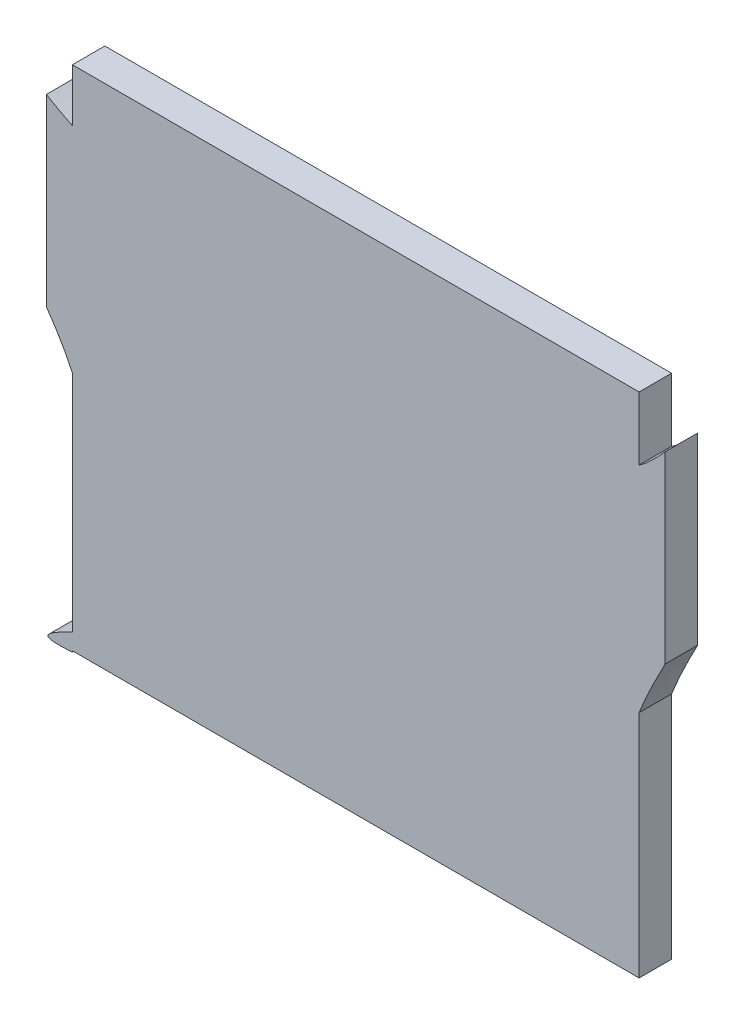
ISO-10303-21;
HEADER;
FILE_DESCRIPTION(('STEP AP214'),'2;1');
FILE_NAME('part.step','',(''),(''),'','','');
FILE_SCHEMA(('AUTOMOTIVE_DESIGN { 1 0 10303 214 1 1 1 1 }'));
ENDSEC;
DATA;
#1=APPLICATION_CONTEXT('core data for automotive mechanical design processes');
#2=APPLICATION_PROTOCOL_DEFINITION('international standard','automotive_design',2000,#1);
#3=PRODUCT_CONTEXT('',#1,'mechanical');
#4=PRODUCT('Part','Part','',(#3));
#5=PRODUCT_RELATED_PRODUCT_CATEGORY('part','',(#4));
#6=PRODUCT_DEFINITION_FORMATION('','',#4);
#7=PRODUCT_DEFINITION_CONTEXT('part definition',#1,'design');
#8=PRODUCT_DEFINITION('design','',#6,#7);
#9=PRODUCT_DEFINITION_SHAPE('','',#8);
#10=(LENGTH_UNIT() NAMED_UNIT(*) SI_UNIT(.MILLI.,.METRE.));
#11=(NAMED_UNIT(*) PLANE_ANGLE_UNIT() SI_UNIT($,.RADIAN.));
#12=(NAMED_UNIT(*) SI_UNIT($,.STERADIAN.) SOLID_ANGLE_UNIT());
#13=UNCERTAINTY_MEASURE_WITH_UNIT(LENGTH_MEASURE(1.E-05),#10,'distance_accuracy_value','');
#14=(GEOMETRIC_REPRESENTATION_CONTEXT(3) GLOBAL_UNCERTAINTY_ASSIGNED_CONTEXT((#13)) GLOBAL_UNIT_ASSIGNED_CONTEXT((#10,
#11,#12)) REPRESENTATION_CONTEXT('',''));
#15=CARTESIAN_POINT('',(0.,0.,0.));
#16=DIRECTION('',(0.,0.,1.));
#17=DIRECTION('',(1.,0.,0.));
#18=AXIS2_PLACEMENT_3D('',#15,#16,#17);
#19=CARTESIAN_POINT('',(-69.7223123683583,-123.736,51.9999999999997));
#20=DIRECTION('',(-0.973511689159507,0.228637247774295,0.));
#21=DIRECTION('',(-0.228637247774295,-0.973511689159507,0.));
#22=AXIS2_PLACEMENT_3D('',#19,#20,#21);
#23=PLANE('',#22);
#24=DIRECTION('',(0.228637247774295,0.973511689159507,0.));
#25=VECTOR('',#24,1.);
#26=CARTESIAN_POINT('',(-69.7223123683583,-123.736,43.9999999999997));
#27=LINE('',#26,#25);
#28=CARTESIAN_POINT('',(-69.7932068177427,-124.0378605929,43.9999999999997));
#29=VERTEX_POINT('',#28);
#30=CARTESIAN_POINT('',(-69.7223123683583,-123.736,43.9999999999997));
#31=VERTEX_POINT('',#30);
#32=EDGE_CURVE('E220',#29,#31,#27,.T.);
#33=ORIENTED_EDGE('',*,*,#32,.T.);
#34=DIRECTION('',(0.,0.,-1.));
#35=VECTOR('',#34,1.);
#36=CARTESIAN_POINT('',(-69.7223123683583,-123.736,51.9999999999997));
#37=LINE('',#36,#35);
#38=CARTESIAN_POINT('',(-69.7223123683583,-123.736,51.9999999999997));
#39=VERTEX_POINT('',#38);
#40=EDGE_CURVE('E11',#39,#31,#37,.T.);
#41=ORIENTED_EDGE('',*,*,#40,.F.);
#42=DIRECTION('',(0.228637247774295,0.973511689159507,0.));
#43=VECTOR('',#42,1.);
#44=CARTESIAN_POINT('',(-69.7223123683583,-123.736,51.9999999999997));
#45=LINE('',#44,#43);
#46=CARTESIAN_POINT('',(-69.7932068177427,-124.0378605929,51.9999999999997));
#47=VERTEX_POINT('',#46);
#48=EDGE_CURVE('E181',#47,#39,#45,.T.);
#49=ORIENTED_EDGE('',*,*,#48,.F.);
#50=DIRECTION('',(0.,0.,-1.));
#51=VECTOR('',#50,1.);
#52=CARTESIAN_POINT('',(-69.7932068177427,-124.0378605929,51.9999999999997));
#53=LINE('',#52,#51);
#54=EDGE_CURVE('E166',#47,#29,#53,.T.);
#55=ORIENTED_EDGE('',*,*,#54,.T.);
#56=EDGE_LOOP('',(#33,#41,#49,#55));
#57=FACE_BOUND('',#56,.T.);
#58=ADVANCED_FACE('F30',(#57),#23,.F.);
#59=CARTESIAN_POINT('',(-69.7223123683583,-123.736,51.9999999999997));
#60=DIRECTION('',(0.,1.,0.));
#61=DIRECTION('',(-1.,0.,0.));
#62=AXIS2_PLACEMENT_3D('',#59,#60,#61);
#63=PLANE('',#62);
#64=DIRECTION('',(1.,0.,0.));
#65=VECTOR('',#64,1.);
#66=CARTESIAN_POINT('',(-69.7223123683583,-123.736,43.9999999999997));
#67=LINE('',#66,#65);
#68=CARTESIAN_POINT('',(69.7871756056273,-123.736,43.9999999999997));
#69=VERTEX_POINT('',#68);
#70=EDGE_CURVE('E214',#31,#69,#67,.T.);
#71=ORIENTED_EDGE('',*,*,#70,.T.);
#72=DIRECTION('',(0.,0.,-1.));
#73=VECTOR('',#72,1.);
#74=CARTESIAN_POINT('',(69.7871756056273,-123.736,51.9999999999997));
#75=LINE('',#74,#73);
#76=CARTESIAN_POINT('',(69.7871756056273,-123.736,51.9999999999997));
#77=VERTEX_POINT('',#76);
#78=EDGE_CURVE('E39',#77,#69,#75,.T.);
#79=ORIENTED_EDGE('',*,*,#78,.F.);
#80=DIRECTION('',(1.,0.,0.));
#81=VECTOR('',#80,1.);
#82=CARTESIAN_POINT('',(-69.7223123683583,-123.736,51.9999999999997));
#83=LINE('',#82,#81);
#84=EDGE_CURVE('E111',#39,#77,#83,.T.);
#85=ORIENTED_EDGE('',*,*,#84,.F.);
#86=ORIENTED_EDGE('',*,*,#40,.T.);
#87=EDGE_LOOP('',(#71,#79,#85,#86));
#88=FACE_BOUND('',#87,.T.);
#89=ADVANCED_FACE('F403',(#88),#63,.F.);
#90=CARTESIAN_POINT('',(69.7870545014945,-67.1329233019573,51.9999999999997));
#91=DIRECTION('',(-0.999999999997711,-2.13953268890916E-06,0.));
#92=DIRECTION('',(2.13953268890916E-06,-0.999999999997711,0.));
#93=AXIS2_PLACEMENT_3D('',#90,#91,#92);
#94=PLANE('',#93);
#95=DIRECTION('',(-2.13953268890916E-06,0.999999999997711,0.));
#96=VECTOR('',#95,1.);
#97=CARTESIAN_POINT('',(69.7870545014945,-67.1329233019573,43.9999999999997));
#98=LINE('',#97,#96);
#99=CARTESIAN_POINT('',(69.7870545014945,-67.1329233019573,43.9999999999997));
#100=VERTEX_POINT('',#99);
#101=EDGE_CURVE('E219',#69,#100,#98,.T.);
#102=ORIENTED_EDGE('',*,*,#101,.T.);
#103=DIRECTION('',(0.,0.,-1.));
#104=VECTOR('',#103,1.);
#105=CARTESIAN_POINT('',(69.7870545014945,-67.1329233019573,51.9999999999997));
#106=LINE('',#105,#104);
#107=CARTESIAN_POINT('',(69.7870545014945,-67.1329233019573,51.9999999999997));
#108=VERTEX_POINT('',#107);
#109=EDGE_CURVE('E234',#108,#100,#106,.T.);
#110=ORIENTED_EDGE('',*,*,#109,.F.);
#111=DIRECTION('',(-2.13953268890916E-06,0.999999999997711,0.));
#112=VECTOR('',#111,1.);
#113=CARTESIAN_POINT('',(69.7870545014945,-67.1329233019573,51.9999999999997));
#114=LINE('',#113,#112);
#115=EDGE_CURVE('E431',#77,#108,#114,.T.);
#116=ORIENTED_EDGE('',*,*,#115,.F.);
#117=ORIENTED_EDGE('',*,*,#78,.T.);
#118=EDGE_LOOP('',(#102,#110,#116,#117));
#119=FACE_BOUND('',#118,.T.);
#120=ADVANCED_FACE('F408',(#119),#94,.F.);
#121=CARTESIAN_POINT('',(69.7870545014945,-67.1329233019573,51.9999999999997));
#122=CARTESIAN_POINT('',(69.8987351477501,-66.8508845632766,51.9999999999997));
#123=CARTESIAN_POINT('',(70.1233875917448,-66.2835464069344,51.9999999999997));
#124=CARTESIAN_POINT('',(70.474179310848,-65.4325837451714,51.9999999999997));
#125=CARTESIAN_POINT('',(70.8369325037786,-64.5757193694243,51.9999999999997));
#126=CARTESIAN_POINT('',(71.2120298176207,-63.713702372659,51.9999999999997));
#127=CARTESIAN_POINT('',(71.5986738004664,-62.8468379595476,51.9999999999997));
#128=CARTESIAN_POINT('',(71.996383934673,-61.9755732179745,51.9999999999997));
#129=CARTESIAN_POINT('',(72.4045638303992,-61.1003269345542,51.9999999999997));
#130=CARTESIAN_POINT('',(72.8226204128379,-60.2215440051033,51.9999999999997));
#131=CARTESIAN_POINT('',(73.2499007470807,-59.3396688384362,51.9999999999997));
#132=CARTESIAN_POINT('',(73.6856852534667,-58.4551377543125,51.9999999999997));
#133=CARTESIAN_POINT('',(74.1292519903981,-57.5684069838605,51.9999999999997));
#134=CARTESIAN_POINT('',(74.5798220159515,-56.6799235201794,51.9999999999997));
#135=CARTESIAN_POINT('',(75.0367465385745,-55.7902230289632,51.9999999999997));
#136=CARTESIAN_POINT('',(75.5790396430957,-54.7453804926052,51.9999999999997));
#137=CARTESIAN_POINT('',(75.9726214225833,-53.999094187479,51.9999999999997));
#138=CARTESIAN_POINT('',(76.2101404755321,-53.5487247200384,51.9999999999997));
#139=B_SPLINE_CURVE_WITH_KNOTS('',3,(#121,#122,#123,#124,#125,#126,#127,#128,#129,#130,#131,
#132,#133,#134,#135,#136,#137,#138),.UNSPECIFIED.,.F.,.F.,(4,1,1,1,1,1,1,1,1,1,1,1,1,1,1,4),(0.,
0.0605306303006695,0.121761061468543,0.183662458002644,0.246203083783382,0.309349045374621,
0.373065313413783,0.437314665948885,0.502057631104992,0.567252397263625,0.632854876290372,
0.69881919988516,0.76509788291915,0.831641464196542,0.898398853646323,1.),.UNSPECIFIED.);
#140=DIRECTION('',(0.,0.,-1.));
#141=VECTOR('',#140,1.);
#142=SURFACE_OF_LINEAR_EXTRUSION('',#139,#141);
#143=CARTESIAN_POINT('',(69.7870545014945,-67.1329233019573,43.9999999999997));
#144=CARTESIAN_POINT('',(69.8987351477501,-66.8508845632766,43.9999999999997));
#145=CARTESIAN_POINT('',(70.1233875917448,-66.2835464069344,43.9999999999997));
#146=CARTESIAN_POINT('',(70.474179310848,-65.4325837451714,43.9999999999997));
#147=CARTESIAN_POINT('',(70.8369325037786,-64.5757193694243,43.9999999999997));
#148=CARTESIAN_POINT('',(71.2120298176207,-63.713702372659,43.9999999999997));
#149=CARTESIAN_POINT('',(71.5986738004664,-62.8468379595476,43.9999999999997));
#150=CARTESIAN_POINT('',(71.996383934673,-61.9755732179745,43.9999999999997));
#151=CARTESIAN_POINT('',(72.4045638303992,-61.1003269345542,43.9999999999997));
#152=CARTESIAN_POINT('',(72.8226204128379,-60.2215440051033,43.9999999999997));
#153=CARTESIAN_POINT('',(73.2499007470807,-59.3396688384362,43.9999999999997));
#154=CARTESIAN_POINT('',(73.6856852534667,-58.4551377543125,43.9999999999997));
#155=CARTESIAN_POINT('',(74.1292519903981,-57.5684069838605,43.9999999999997));
#156=CARTESIAN_POINT('',(74.5798220159515,-56.6799235201794,43.9999999999997));
#157=CARTESIAN_POINT('',(75.0367465385745,-55.7902230289632,43.9999999999997));
#158=CARTESIAN_POINT('',(75.5790396430957,-54.7453804926052,43.9999999999997));
#159=CARTESIAN_POINT('',(75.9726214225833,-53.999094187479,43.9999999999997));
#160=CARTESIAN_POINT('',(76.2101404755321,-53.5487247200384,43.9999999999997));
#161=B_SPLINE_CURVE_WITH_KNOTS('',3,(#143,#144,#145,#146,#147,#148,#149,#150,#151,#152,#153,
#154,#155,#156,#157,#158,#159,#160),.UNSPECIFIED.,.F.,.F.,(4,1,1,1,1,1,1,1,1,1,1,1,1,1,1,4),(0.,
0.0605306303006695,0.121761061468543,0.183662458002644,0.246203083783382,0.309349045374621,
0.373065313413783,0.437314665948885,0.502057631104992,0.567252397263625,0.632854876290372,
0.69881919988516,0.76509788291915,0.831641464196542,0.898398853646323,1.),.UNSPECIFIED.);
#162=CARTESIAN_POINT('',(76.2101404755321,-53.5487247200384,43.9999999999997));
#163=VERTEX_POINT('',#162);
#164=EDGE_CURVE('E454',#100,#163,#161,.T.);
#165=ORIENTED_EDGE('',*,*,#164,.T.);
#166=DIRECTION('',(0.,0.,-1.));
#167=VECTOR('',#166,1.);
#168=CARTESIAN_POINT('',(76.2101404755321,-53.5487247200384,51.9999999999997));
#169=LINE('',#168,#167);
#170=CARTESIAN_POINT('',(76.2101404755321,-53.5487247200384,51.9999999999997));
#171=VERTEX_POINT('',#170);
#172=EDGE_CURVE('E443',#171,#163,#169,.T.);
#173=ORIENTED_EDGE('',*,*,#172,.F.);
#174=CARTESIAN_POINT('',(76.2101404755321,-53.5487247200384,51.9999999999997));
#175=CARTESIAN_POINT('',(75.9726214225833,-53.999094187479,51.9999999999997));
#176=CARTESIAN_POINT('',(75.5790396430957,-54.7453804926052,51.9999999999997));
#177=CARTESIAN_POINT('',(75.0367465385745,-55.7902230289632,51.9999999999997));
#178=CARTESIAN_POINT('',(74.5798220159515,-56.6799235201794,51.9999999999997));
#179=CARTESIAN_POINT('',(74.1292519903981,-57.5684069838605,51.9999999999997));
#180=CARTESIAN_POINT('',(73.6856852534667,-58.4551377543125,51.9999999999997));
#181=CARTESIAN_POINT('',(73.2499007470807,-59.3396688384362,51.9999999999997));
#182=CARTESIAN_POINT('',(72.8226204128379,-60.2215440051033,51.9999999999997));
#183=CARTESIAN_POINT('',(72.4045638303992,-61.1003269345542,51.9999999999997));
#184=CARTESIAN_POINT('',(71.996383934673,-61.9755732179745,51.9999999999997));
#185=CARTESIAN_POINT('',(71.5986738004664,-62.8468379595476,51.9999999999997));
#186=CARTESIAN_POINT('',(71.2120298176207,-63.713702372659,51.9999999999997));
#187=CARTESIAN_POINT('',(70.8369325037786,-64.5757193694243,51.9999999999997));
#188=CARTESIAN_POINT('',(70.474179310848,-65.4325837451714,51.9999999999997));
#189=CARTESIAN_POINT('',(70.1233875917448,-66.2835464069344,51.9999999999997));
#190=CARTESIAN_POINT('',(69.8987351477501,-66.8508845632766,51.9999999999997));
#191=CARTESIAN_POINT('',(69.7870545014945,-67.1329233019573,51.9999999999997));
#192=B_SPLINE_CURVE_WITH_KNOTS('',3,(#174,#175,#176,#177,#178,#179,#180,#181,#182,#183,#184,
#185,#186,#187,#188,#189,#190,#191),.UNSPECIFIED.,.F.,.F.,(4,1,1,1,1,1,1,1,1,1,1,1,1,1,1,4),(0.,
0.101601146353677,0.168358535803458,0.23490211708085,0.30118080011484,0.367145123709628,
0.432747602736375,0.497942368895008,0.562685334051115,0.626934686586217,0.690650954625379,
0.753796916216618,0.816337541997356,0.878238938531457,0.93946936969933,1.),.UNSPECIFIED.);
#193=EDGE_CURVE('E433',#108,#171,#192,.F.);
#194=ORIENTED_EDGE('',*,*,#193,.F.);
#195=ORIENTED_EDGE('',*,*,#109,.T.);
#196=EDGE_LOOP('',(#165,#173,#194,#195));
#197=FACE_BOUND('',#196,.T.);
#198=ADVANCED_FACE('F459',(#197),#142,.F.);
#199=CARTESIAN_POINT('',(76.210259011342,-8.27745407916536,51.9999999999997));
#200=DIRECTION('',(-0.999999999996572,2.6183451067489E-06,0.));
#201=DIRECTION('',(-2.6183451067489E-06,-0.999999999996572,0.));
#202=AXIS2_PLACEMENT_3D('',#199,#200,#201);
#203=PLANE('',#202);
#204=DIRECTION('',(2.6183451067489E-06,0.999999999996572,0.));
#205=VECTOR('',#204,1.);
#206=CARTESIAN_POINT('',(76.210259011342,-8.27745407916536,43.9999999999997));
#207=LINE('',#206,#205);
#208=CARTESIAN_POINT('',(76.210259011342,-8.27745407916536,43.9999999999997));
#209=VERTEX_POINT('',#208);
#210=EDGE_CURVE('E588',#163,#209,#207,.T.);
#211=ORIENTED_EDGE('',*,*,#210,.T.);
#212=DIRECTION('',(0.,0.,-1.));
#213=VECTOR('',#212,1.);
#214=CARTESIAN_POINT('',(76.210259011342,-8.27745407916536,51.9999999999997));
#215=LINE('',#214,#213);
#216=CARTESIAN_POINT('',(76.210259011342,-8.27745407916536,51.9999999999997));
#217=VERTEX_POINT('',#216);
#218=EDGE_CURVE('E448',#217,#209,#215,.T.);
#219=ORIENTED_EDGE('',*,*,#218,.F.);
#220=DIRECTION('',(2.6183451067489E-06,0.999999999996572,0.));
#221=VECTOR('',#220,1.);
#222=CARTESIAN_POINT('',(76.210259011342,-8.27745407916536,51.9999999999997));
#223=LINE('',#222,#221);
#224=EDGE_CURVE('E278',#171,#217,#223,.T.);
#225=ORIENTED_EDGE('',*,*,#224,.F.);
#226=ORIENTED_EDGE('',*,*,#172,.T.);
#227=EDGE_LOOP('',(#211,#219,#225,#226));
#228=FACE_BOUND('',#227,.T.);
#229=ADVANCED_FACE('F292',(#228),#203,.F.);
#230=CARTESIAN_POINT('',(76.210259011342,-8.27745407916536,51.9999999999997));
#231=CARTESIAN_POINT('',(76.1707094278855,-8.32424548017544,51.9999999999997));
#232=CARTESIAN_POINT('',(75.7613767193911,-8.80852999687017,51.9999999999997));
#233=CARTESIAN_POINT('',(75.1401150225099,-9.49014430645207,51.9999999999997));
#234=CARTESIAN_POINT('',(74.3431551639856,-10.3140996062215,51.9999999999997));
#235=CARTESIAN_POINT('',(73.5384854746003,-11.1315376096416,51.9999999999997));
#236=CARTESIAN_POINT('',(72.4937923496919,-12.1663865474611,51.9999999999997));
#237=CARTESIAN_POINT('',(71.2121696523156,-13.3132020448576,51.9999999999997));
#238=CARTESIAN_POINT('',(70.2774630022475,-14.0241571564419,51.9999999999997));
#239=CARTESIAN_POINT('',(69.8094644388859,-14.3340722231048,51.9999999999997));
#240=CARTESIAN_POINT('',(69.7871280168438,-14.3488637080966,51.9999999999997));
#241=B_SPLINE_CURVE_WITH_KNOTS('',3,(#230,#231,#232,#233,#234,#235,#236,#237,#238,#239,#240),
.UNSPECIFIED.,.F.,.F.,(4,1,1,1,1,1,1,1,4),(0.,0.0207459187732433,0.214717384596452,
0.312095933804728,0.408918069322787,0.603125471273589,0.809930821364082,0.990928464906596,1.),.UNSPECIFIED.);
#242=DIRECTION('',(0.,0.,-1.));
#243=VECTOR('',#242,1.);
#244=SURFACE_OF_LINEAR_EXTRUSION('',#241,#243);
#245=CARTESIAN_POINT('',(76.210259011342,-8.27745407916536,43.9999999999997));
#246=CARTESIAN_POINT('',(76.1707094278855,-8.32424548017544,43.9999999999997));
#247=CARTESIAN_POINT('',(75.7613767193911,-8.80852999687017,43.9999999999997));
#248=CARTESIAN_POINT('',(75.1401150225099,-9.49014430645207,43.9999999999997));
#249=CARTESIAN_POINT('',(74.3431551639856,-10.3140996062215,43.9999999999997));
#250=CARTESIAN_POINT('',(73.5384854746003,-11.1315376096416,43.9999999999997));
#251=CARTESIAN_POINT('',(72.4937923496919,-12.1663865474611,43.9999999999997));
#252=CARTESIAN_POINT('',(71.2121696523156,-13.3132020448576,43.9999999999997));
#253=CARTESIAN_POINT('',(70.2774630022475,-14.0241571564419,43.9999999999997));
#254=CARTESIAN_POINT('',(69.8094644388859,-14.3340722231048,43.9999999999997));
#255=CARTESIAN_POINT('',(69.7871280168438,-14.3488637080966,43.9999999999997));
#256=B_SPLINE_CURVE_WITH_KNOTS('',3,(#245,#246,#247,#248,#249,#250,#251,#252,#253,#254,#255),
.UNSPECIFIED.,.F.,.F.,(4,1,1,1,1,1,1,1,4),(0.,0.0207459187732433,0.214717384596452,
0.312095933804728,0.408918069322787,0.603125471273589,0.809930821364082,0.990928464906596,1.),.UNSPECIFIED.);
#257=CARTESIAN_POINT('',(69.7871280168438,-14.3488637080966,43.9999999999997));
#258=VERTEX_POINT('',#257);
#259=EDGE_CURVE('E584',#209,#258,#256,.T.);
#260=ORIENTED_EDGE('',*,*,#259,.T.);
#261=DIRECTION('',(0.,0.,-1.));
#262=VECTOR('',#261,1.);
#263=CARTESIAN_POINT('',(69.7871280168438,-14.3488637080966,51.9999999999997));
#264=LINE('',#263,#262);
#265=CARTESIAN_POINT('',(69.7871280168438,-14.3488637080966,51.9999999999997));
#266=VERTEX_POINT('',#265);
#267=EDGE_CURVE('E232',#266,#258,#264,.T.);
#268=ORIENTED_EDGE('',*,*,#267,.F.);
#269=CARTESIAN_POINT('',(69.7871280168438,-14.3488637080966,51.9999999999997));
#270=CARTESIAN_POINT('',(69.8094644388859,-14.3340722231048,51.9999999999997));
#271=CARTESIAN_POINT('',(70.2774630022475,-14.0241571564419,51.9999999999997));
#272=CARTESIAN_POINT('',(71.2121696523156,-13.3132020448576,51.9999999999997));
#273=CARTESIAN_POINT('',(72.4937923496919,-12.1663865474611,51.9999999999997));
#274=CARTESIAN_POINT('',(73.5384854746003,-11.1315376096416,51.9999999999997));
#275=CARTESIAN_POINT('',(74.3431551639856,-10.3140996062215,51.9999999999997));
#276=CARTESIAN_POINT('',(75.1401150225099,-9.49014430645207,51.9999999999997));
#277=CARTESIAN_POINT('',(75.7613767193911,-8.80852999687017,51.9999999999997));
#278=CARTESIAN_POINT('',(76.1707094278855,-8.32424548017544,51.9999999999997));
#279=CARTESIAN_POINT('',(76.210259011342,-8.27745407916536,51.9999999999997));
#280=B_SPLINE_CURVE_WITH_KNOTS('',3,(#269,#270,#271,#272,#273,#274,#275,#276,#277,#278,#279),
.UNSPECIFIED.,.F.,.F.,(4,1,1,1,1,1,1,1,4),(0.,0.0090715350934043,0.190069178635918,
0.396874528726411,0.591081930677213,0.687904066195272,0.785282615403548,0.979254081226757,1.),.UNSPECIFIED.);
#281=EDGE_CURVE('E273',#217,#266,#280,.F.);
#282=ORIENTED_EDGE('',*,*,#281,.F.);
#283=ORIENTED_EDGE('',*,*,#218,.T.);
#284=EDGE_LOOP('',(#260,#268,#282,#283));
#285=FACE_BOUND('',#284,.T.);
#286=ADVANCED_FACE('F280',(#285),#244,.F.);
#287=CARTESIAN_POINT('',(69.7871799845661,1.25599999999985,51.9999999999997));
#288=DIRECTION('',(-0.999999999994455,3.3302259653013E-06,0.));
#289=DIRECTION('',(-3.3302259653013E-06,-0.999999999994455,0.));
#290=AXIS2_PLACEMENT_3D('',#287,#288,#289);
#291=PLANE('',#290);
#292=DIRECTION('',(3.3302259653013E-06,0.999999999994455,0.));
#293=VECTOR('',#292,1.);
#294=CARTESIAN_POINT('',(69.7871799845661,1.25599999999985,43.9999999999997));
#295=LINE('',#294,#293);
#296=CARTESIAN_POINT('',(69.7871799845661,1.25599999999985,43.9999999999997));
#297=VERTEX_POINT('',#296);
#298=EDGE_CURVE('E224',#258,#297,#295,.T.);
#299=ORIENTED_EDGE('',*,*,#298,.T.);
#300=DIRECTION('',(0.,0.,-1.));
#301=VECTOR('',#300,1.);
#302=CARTESIAN_POINT('',(69.7871799845661,1.25599999999985,51.9999999999997));
#303=LINE('',#302,#301);
#304=CARTESIAN_POINT('',(69.7871799845661,1.25599999999985,51.9999999999997));
#305=VERTEX_POINT('',#304);
#306=EDGE_CURVE('E228',#305,#297,#303,.T.);
#307=ORIENTED_EDGE('',*,*,#306,.F.);
#308=DIRECTION('',(3.3302259653013E-06,0.999999999994455,0.));
#309=VECTOR('',#308,1.);
#310=CARTESIAN_POINT('',(69.7871799845661,1.25599999999985,51.9999999999997));
#311=LINE('',#310,#309);
#312=EDGE_CURVE('E310',#266,#305,#311,.T.);
#313=ORIENTED_EDGE('',*,*,#312,.F.);
#314=ORIENTED_EDGE('',*,*,#267,.T.);
#315=EDGE_LOOP('',(#299,#307,#313,#314));
#316=FACE_BOUND('',#315,.T.);
#317=ADVANCED_FACE('F291',(#316),#291,.F.);
#318=CARTESIAN_POINT('',(69.7871799845661,1.25599999999985,51.9999999999997));
#319=DIRECTION('',(0.,-1.,0.));
#320=DIRECTION('',(1.,0.,0.));
#321=AXIS2_PLACEMENT_3D('',#318,#319,#320);
#322=PLANE('',#321);
#323=DIRECTION('',(-1.,0.,0.));
#324=VECTOR('',#323,1.);
#325=CARTESIAN_POINT('',(69.7871799845661,1.25599999999985,43.9999999999997));
#326=LINE('',#325,#324);
#327=CARTESIAN_POINT('',(-69.7871669522999,1.25599999999988,43.9999999999997));
#328=VERTEX_POINT('',#327);
#329=EDGE_CURVE('E221',#297,#328,#326,.T.);
#330=ORIENTED_EDGE('',*,*,#329,.T.);
#331=DIRECTION('',(0.,0.,-1.));
#332=VECTOR('',#331,1.);
#333=CARTESIAN_POINT('',(-69.7871669522999,1.25599999999988,51.9999999999997));
#334=LINE('',#333,#332);
#335=CARTESIAN_POINT('',(-69.7871669522999,1.25599999999988,51.9999999999997));
#336=VERTEX_POINT('',#335);
#337=EDGE_CURVE('E225',#336,#328,#334,.T.);
#338=ORIENTED_EDGE('',*,*,#337,.F.);
#339=DIRECTION('',(-1.,0.,0.));
#340=VECTOR('',#339,1.);
#341=CARTESIAN_POINT('',(69.7871799845661,1.25599999999985,51.9999999999997));
#342=LINE('',#341,#340);
#343=EDGE_CURVE('E305',#305,#336,#342,.T.);
#344=ORIENTED_EDGE('',*,*,#343,.F.);
#345=ORIENTED_EDGE('',*,*,#306,.T.);
#346=EDGE_LOOP('',(#330,#338,#344,#345));
#347=FACE_BOUND('',#346,.T.);
#348=ADVANCED_FACE('F498',(#347),#322,.F.);
#349=CARTESIAN_POINT('',(-69.7871669522999,1.25599999999988,51.9999999999997));
#350=DIRECTION('',(0.999999999800094,1.99953065799111E-05,0.));
#351=DIRECTION('',(-1.99953065799111E-05,0.999999999800094,0.));
#352=AXIS2_PLACEMENT_3D('',#349,#350,#351);
#353=PLANE('',#352);
#354=DIRECTION('',(1.99953065799111E-05,-0.999999999800094,0.));
#355=VECTOR('',#354,1.);
#356=CARTESIAN_POINT('',(-69.7871669522999,1.25599999999988,43.9999999999997));
#357=LINE('',#356,#355);
#358=CARTESIAN_POINT('',(-69.786907975781,-11.6958653667162,43.9999999999997));
#359=VERTEX_POINT('',#358);
#360=EDGE_CURVE('E223',#328,#359,#357,.T.);
#361=ORIENTED_EDGE('',*,*,#360,.T.);
#362=DIRECTION('',(0.,0.,-1.));
#363=VECTOR('',#362,1.);
#364=CARTESIAN_POINT('',(-69.786907975781,-11.6958653667162,51.9999999999997));
#365=LINE('',#364,#363);
#366=CARTESIAN_POINT('',(-69.786907975781,-11.6958653667162,51.9999999999997));
#367=VERTEX_POINT('',#366);
#368=EDGE_CURVE('E229',#367,#359,#365,.T.);
#369=ORIENTED_EDGE('',*,*,#368,.F.);
#370=DIRECTION('',(1.99953065799111E-05,-0.999999999800094,0.));
#371=VECTOR('',#370,1.);
#372=CARTESIAN_POINT('',(-69.7871669522999,1.25599999999988,51.9999999999997));
#373=LINE('',#372,#371);
#374=EDGE_CURVE('E309',#336,#367,#373,.T.);
#375=ORIENTED_EDGE('',*,*,#374,.F.);
#376=ORIENTED_EDGE('',*,*,#337,.T.);
#377=EDGE_LOOP('',(#361,#369,#375,#376));
#378=FACE_BOUND('',#377,.T.);
#379=ADVANCED_FACE('F324',(#378),#353,.F.);
#380=CARTESIAN_POINT('',(-69.786907975781,-11.6958653667162,51.9999999999997));
#381=CARTESIAN_POINT('',(-69.8955306085048,-11.6487576756369,51.9999999999997));
#382=CARTESIAN_POINT('',(-70.1144782253131,-11.5538040141712,51.9999999999997));
#383=CARTESIAN_POINT('',(-70.4417889055179,-11.4032040928395,51.9999999999997));
#384=CARTESIAN_POINT('',(-70.7709405875501,-11.2468418895113,51.9999999999997));
#385=CARTESIAN_POINT('',(-71.1006417737461,-11.0854688611094,51.9999999999997));
#386=CARTESIAN_POINT('',(-71.853512668118,-10.7084419157255,51.9999999999997));
#387=CARTESIAN_POINT('',(-73.0050561545857,-10.1056125662571,51.9999999999997));
#388=CARTESIAN_POINT('',(-74.2988494506271,-9.40609870469594,51.9999999999997));
#389=CARTESIAN_POINT('',(-75.3114135751951,-8.82299419917881,51.9999999999997));
#390=CARTESIAN_POINT('',(-75.8639097615492,-8.49133377814753,51.9999999999997));
#391=CARTESIAN_POINT('',(-76.1621359516664,-8.30717491150047,51.9999999999997));
#392=CARTESIAN_POINT('',(-76.2099585527271,-8.27764378276897,51.9999999999997));
#393=B_SPLINE_CURVE_WITH_KNOTS('',3,(#380,#381,#382,#383,#384,#385,#386,#387,#388,#389,#390,
#391,#392),.UNSPECIFIED.,.F.,.F.,(4,1,1,1,1,1,1,1,1,1,4),(0.,0.0487851803798605,
0.0983349299487392,0.148451785398495,0.198937848338315,0.24958727041676,0.495399035570065,
0.734490034724737,0.855572554666401,0.976840075321043,1.),.UNSPECIFIED.);
#394=DIRECTION('',(0.,0.,-1.));
#395=VECTOR('',#394,1.);
#396=SURFACE_OF_LINEAR_EXTRUSION('',#393,#395);
#397=CARTESIAN_POINT('',(-69.786907975781,-11.6958653667162,43.9999999999997));
#398=CARTESIAN_POINT('',(-69.8955306085048,-11.6487576756369,43.9999999999997));
#399=CARTESIAN_POINT('',(-70.1144782253131,-11.5538040141712,43.9999999999997));
#400=CARTESIAN_POINT('',(-70.4417889055179,-11.4032040928395,43.9999999999997));
#401=CARTESIAN_POINT('',(-70.7709405875501,-11.2468418895113,43.9999999999997));
#402=CARTESIAN_POINT('',(-71.1006417737461,-11.0854688611094,43.9999999999997));
#403=CARTESIAN_POINT('',(-71.853512668118,-10.7084419157255,43.9999999999997));
#404=CARTESIAN_POINT('',(-73.0050561545857,-10.1056125662571,43.9999999999997));
#405=CARTESIAN_POINT('',(-74.2988494506271,-9.40609870469594,43.9999999999997));
#406=CARTESIAN_POINT('',(-75.3114135751951,-8.82299419917881,43.9999999999997));
#407=CARTESIAN_POINT('',(-75.8639097615492,-8.49133377814753,43.9999999999997));
#408=CARTESIAN_POINT('',(-76.1621359516664,-8.30717491150047,43.9999999999997));
#409=CARTESIAN_POINT('',(-76.2099585527271,-8.27764378276897,43.9999999999997));
#410=B_SPLINE_CURVE_WITH_KNOTS('',3,(#397,#398,#399,#400,#401,#402,#403,#404,#405,#406,#407,
#408,#409),.UNSPECIFIED.,.F.,.F.,(4,1,1,1,1,1,1,1,1,1,4),(0.,0.0487851803798605,
0.0983349299487392,0.148451785398495,0.198937848338315,0.24958727041676,0.495399035570065,
0.734490034724737,0.855572554666401,0.976840075321043,1.),.UNSPECIFIED.);
#411=CARTESIAN_POINT('',(-76.2099585527271,-8.27764378276897,43.9999999999997));
#412=VERTEX_POINT('',#411);
#413=EDGE_CURVE('E347',#359,#412,#410,.T.);
#414=ORIENTED_EDGE('',*,*,#413,.T.);
#415=DIRECTION('',(0.,0.,-1.));
#416=VECTOR('',#415,1.);
#417=CARTESIAN_POINT('',(-76.2099585527271,-8.27764378276897,51.9999999999997));
#418=LINE('',#417,#416);
#419=CARTESIAN_POINT('',(-76.2099585527271,-8.27764378276897,51.9999999999997));
#420=VERTEX_POINT('',#419);
#421=EDGE_CURVE('E374',#420,#412,#418,.T.);
#422=ORIENTED_EDGE('',*,*,#421,.F.);
#423=CARTESIAN_POINT('',(-76.2099585527271,-8.27764378276897,51.9999999999997));
#424=CARTESIAN_POINT('',(-76.1621359516664,-8.30717491150047,51.9999999999997));
#425=CARTESIAN_POINT('',(-75.8639097615492,-8.49133377814753,51.9999999999997));
#426=CARTESIAN_POINT('',(-75.3114135751951,-8.82299419917881,51.9999999999997));
#427=CARTESIAN_POINT('',(-74.2988494506271,-9.40609870469594,51.9999999999997));
#428=CARTESIAN_POINT('',(-73.0050561545857,-10.1056125662571,51.9999999999997));
#429=CARTESIAN_POINT('',(-71.853512668118,-10.7084419157255,51.9999999999997));
#430=CARTESIAN_POINT('',(-71.1006417737461,-11.0854688611094,51.9999999999997));
#431=CARTESIAN_POINT('',(-70.7709405875501,-11.2468418895113,51.9999999999997));
#432=CARTESIAN_POINT('',(-70.4417889055179,-11.4032040928395,51.9999999999997));
#433=CARTESIAN_POINT('',(-70.1144782253131,-11.5538040141712,51.9999999999997));
#434=CARTESIAN_POINT('',(-69.8955306085048,-11.6487576756369,51.9999999999997));
#435=CARTESIAN_POINT('',(-69.786907975781,-11.6958653667162,51.9999999999997));
#436=B_SPLINE_CURVE_WITH_KNOTS('',3,(#423,#424,#425,#426,#427,#428,#429,#430,#431,#432,#433,
#434,#435),.UNSPECIFIED.,.F.,.F.,(4,1,1,1,1,1,1,1,1,1,4),(0.,0.0231599246789566,
0.144427445333599,0.265509965275263,0.504600964429935,0.75041272958324,0.801062151661685,
0.851548214601505,0.901665070051261,0.95121481962014,1.),.UNSPECIFIED.);
#437=EDGE_CURVE('E372',#367,#420,#436,.F.);
#438=ORIENTED_EDGE('',*,*,#437,.F.);
#439=ORIENTED_EDGE('',*,*,#368,.T.);
#440=EDGE_LOOP('',(#414,#422,#438,#439));
#441=FACE_BOUND('',#440,.T.);
#442=ADVANCED_FACE('F318',(#441),#396,.F.);
#443=CARTESIAN_POINT('',(-76.2099585527271,-8.27764378276897,51.9999999999997));
#444=DIRECTION('',(0.999999999982887,5.85027287169161E-06,0.));
#445=DIRECTION('',(-5.85027287169161E-06,0.999999999982887,0.));
#446=AXIS2_PLACEMENT_3D('',#443,#444,#445);
#447=PLANE('',#446);
#448=DIRECTION('',(5.85027287169161E-06,-0.999999999982887,0.));
#449=VECTOR('',#448,1.);
#450=CARTESIAN_POINT('',(-76.2099585527271,-8.27764378276897,43.9999999999997));
#451=LINE('',#450,#449);
#452=CARTESIAN_POINT('',(-76.2096936993741,-53.5496095166001,43.9999999999997));
#453=VERTEX_POINT('',#452);
#454=EDGE_CURVE('E360',#412,#453,#451,.T.);
#455=ORIENTED_EDGE('',*,*,#454,.T.);
#456=DIRECTION('',(0.,0.,-1.));
#457=VECTOR('',#456,1.);
#458=CARTESIAN_POINT('',(-76.2096936993741,-53.5496095166001,51.9999999999997));
#459=LINE('',#458,#457);
#460=CARTESIAN_POINT('',(-76.2096936993741,-53.5496095166001,51.9999999999997));
#461=VERTEX_POINT('',#460);
#462=EDGE_CURVE('E161',#461,#453,#459,.T.);
#463=ORIENTED_EDGE('',*,*,#462,.F.);
#464=DIRECTION('',(5.85027287169161E-06,-0.999999999982887,0.));
#465=VECTOR('',#464,1.);
#466=CARTESIAN_POINT('',(-76.2099585527271,-8.27764378276897,51.9999999999997));
#467=LINE('',#466,#465);
#468=EDGE_CURVE('E149',#420,#461,#467,.T.);
#469=ORIENTED_EDGE('',*,*,#468,.F.);
#470=ORIENTED_EDGE('',*,*,#421,.T.);
#471=EDGE_LOOP('',(#455,#463,#469,#470));
#472=FACE_BOUND('',#471,.T.);
#473=ADVANCED_FACE('F323',(#472),#447,.F.);
#474=CARTESIAN_POINT('',(-76.2096936993741,-53.5496095166001,51.9999999999997));
#475=CARTESIAN_POINT('',(-76.027839765227,-53.8081313922568,51.9999999999997));
#476=CARTESIAN_POINT('',(-75.6701640249004,-54.3165999260821,51.9999999999997));
#477=CARTESIAN_POINT('',(-75.152878356121,-55.0737278994551,51.9999999999997));
#478=CARTESIAN_POINT('',(-74.6604380389072,-55.8103065124199,51.9999999999997));
#479=CARTESIAN_POINT('',(-73.7130897624795,-57.2619510763065,51.9999999999997));
#480=CARTESIAN_POINT('',(-72.4106219489402,-59.3836238541776,51.9999999999997));
#481=CARTESIAN_POINT('',(-71.1500792785475,-61.6833761405067,51.9999999999997));
#482=CARTESIAN_POINT('',(-70.308346776541,-63.359550981891,51.9999999999997));
#483=CARTESIAN_POINT('',(-69.9591799002739,-64.1071425622997,51.9999999999997));
#484=CARTESIAN_POINT('',(-69.7869525793412,-64.4758937348683,51.9999999999997));
#485=B_SPLINE_CURVE_WITH_KNOTS('',3,(#474,#475,#476,#477,#478,#479,#480,#481,#482,#483,#484),
.UNSPECIFIED.,.F.,.F.,(4,1,1,1,1,1,1,1,4),(0.,0.074712697240977,0.146947160768348,
0.216744284083706,0.284145753445015,0.556686570884535,0.804970533547428,0.903801291608315,1.),.UNSPECIFIED.);
#486=DIRECTION('',(0.,0.,-1.));
#487=VECTOR('',#486,1.);
#488=SURFACE_OF_LINEAR_EXTRUSION('',#485,#487);
#489=CARTESIAN_POINT('',(-76.2096936993741,-53.5496095166001,43.9999999999997));
#490=CARTESIAN_POINT('',(-76.027839765227,-53.8081313922568,43.9999999999997));
#491=CARTESIAN_POINT('',(-75.6701640249004,-54.3165999260821,43.9999999999997));
#492=CARTESIAN_POINT('',(-75.152878356121,-55.0737278994551,43.9999999999997));
#493=CARTESIAN_POINT('',(-74.6604380389072,-55.8103065124199,43.9999999999997));
#494=CARTESIAN_POINT('',(-73.7130897624795,-57.2619510763065,43.9999999999997));
#495=CARTESIAN_POINT('',(-72.4106219489402,-59.3836238541776,43.9999999999997));
#496=CARTESIAN_POINT('',(-71.1500792785475,-61.6833761405067,43.9999999999997));
#497=CARTESIAN_POINT('',(-70.308346776541,-63.359550981891,43.9999999999997));
#498=CARTESIAN_POINT('',(-69.9591799002739,-64.1071425622997,43.9999999999997));
#499=CARTESIAN_POINT('',(-69.7869525793412,-64.4758937348683,43.9999999999997));
#500=B_SPLINE_CURVE_WITH_KNOTS('',3,(#489,#490,#491,#492,#493,#494,#495,#496,#497,#498,#499),
.UNSPECIFIED.,.F.,.F.,(4,1,1,1,1,1,1,1,4),(0.,0.074712697240977,0.146947160768348,
0.216744284083706,0.284145753445015,0.556686570884535,0.804970533547428,0.903801291608315,1.),.UNSPECIFIED.);
#501=CARTESIAN_POINT('',(-69.7869525793412,-64.4758937348683,43.9999999999997));
#502=VERTEX_POINT('',#501);
#503=EDGE_CURVE('E159',#453,#502,#500,.T.);
#504=ORIENTED_EDGE('',*,*,#503,.T.);
#505=DIRECTION('',(0.,0.,-1.));
#506=VECTOR('',#505,1.);
#507=CARTESIAN_POINT('',(-69.7869525793412,-64.4758937348683,51.9999999999997));
#508=LINE('',#507,#506);
#509=CARTESIAN_POINT('',(-69.7869525793412,-64.4758937348683,51.9999999999997));
#510=VERTEX_POINT('',#509);
#511=EDGE_CURVE('E156',#510,#502,#508,.T.);
#512=ORIENTED_EDGE('',*,*,#511,.F.);
#513=CARTESIAN_POINT('',(-69.7869525793412,-64.4758937348683,51.9999999999997));
#514=CARTESIAN_POINT('',(-69.9591799002739,-64.1071425622997,51.9999999999997));
#515=CARTESIAN_POINT('',(-70.308346776541,-63.359550981891,51.9999999999997));
#516=CARTESIAN_POINT('',(-71.1500792785475,-61.6833761405067,51.9999999999997));
#517=CARTESIAN_POINT('',(-72.4106219489402,-59.3836238541776,51.9999999999997));
#518=CARTESIAN_POINT('',(-73.7130897624795,-57.2619510763065,51.9999999999997));
#519=CARTESIAN_POINT('',(-74.6604380389072,-55.8103065124199,51.9999999999997));
#520=CARTESIAN_POINT('',(-75.152878356121,-55.0737278994551,51.9999999999997));
#521=CARTESIAN_POINT('',(-75.6701640249004,-54.3165999260821,51.9999999999997));
#522=CARTESIAN_POINT('',(-76.027839765227,-53.8081313922568,51.9999999999997));
#523=CARTESIAN_POINT('',(-76.2096936993741,-53.5496095166001,51.9999999999997));
#524=B_SPLINE_CURVE_WITH_KNOTS('',3,(#513,#514,#515,#516,#517,#518,#519,#520,#521,#522,#523),
.UNSPECIFIED.,.F.,.F.,(4,1,1,1,1,1,1,1,4),(0.,0.0961987083916853,0.195029466452572,
0.443313429115465,0.715854246554985,0.783255715916294,0.853052839231652,0.925287302759023,1.),.UNSPECIFIED.);
#525=EDGE_CURVE('E142',#461,#510,#524,.F.);
#526=ORIENTED_EDGE('',*,*,#525,.F.);
#527=ORIENTED_EDGE('',*,*,#462,.T.);
#528=EDGE_LOOP('',(#504,#512,#526,#527));
#529=FACE_BOUND('',#528,.T.);
#530=ADVANCED_FACE('F157',(#529),#488,.F.);
#531=CARTESIAN_POINT('',(-69.7869525793412,-64.4758937348683,51.9999999999997));
#532=DIRECTION('',(0.99999999999995,3.17005508408257E-07,0.));
#533=DIRECTION('',(-3.17005508408257E-07,0.99999999999995,0.));
#534=AXIS2_PLACEMENT_3D('',#531,#532,#533);
#535=PLANE('',#534);
#536=DIRECTION('',(3.17005508408257E-07,-0.99999999999995,0.));
#537=VECTOR('',#536,1.);
#538=CARTESIAN_POINT('',(-69.7869525793412,-64.4758937348683,43.9999999999997));
#539=LINE('',#538,#537);
#540=CARTESIAN_POINT('',(-69.7869350621305,-119.734273349733,43.9999999999997));
#541=VERTEX_POINT('',#540);
#542=EDGE_CURVE('E96',#502,#541,#539,.T.);
#543=ORIENTED_EDGE('',*,*,#542,.T.);
#544=DIRECTION('',(0.,0.,-1.));
#545=VECTOR('',#544,1.);
#546=CARTESIAN_POINT('',(-69.7869350621305,-119.734273349733,51.9999999999997));
#547=LINE('',#546,#545);
#548=CARTESIAN_POINT('',(-69.7869350621305,-119.734273349733,51.9999999999997));
#549=VERTEX_POINT('',#548);
#550=EDGE_CURVE('E162',#549,#541,#547,.T.);
#551=ORIENTED_EDGE('',*,*,#550,.F.);
#552=DIRECTION('',(3.17005508408257E-07,-0.99999999999995,0.));
#553=VECTOR('',#552,1.);
#554=CARTESIAN_POINT('',(-69.7869525793412,-64.4758937348683,51.9999999999997));
#555=LINE('',#554,#553);
#556=EDGE_CURVE('E147',#510,#549,#555,.T.);
#557=ORIENTED_EDGE('',*,*,#556,.F.);
#558=ORIENTED_EDGE('',*,*,#511,.T.);
#559=EDGE_LOOP('',(#543,#551,#557,#558));
#560=FACE_BOUND('',#559,.T.);
#561=ADVANCED_FACE('F164',(#560),#535,.F.);
#562=CARTESIAN_POINT('',(-69.7869350621305,-119.734273349733,51.9999999999997));
#563=CARTESIAN_POINT('',(-70.0848635119756,-119.878235871893,51.9999999999997));
#564=CARTESIAN_POINT('',(-70.9485995153611,-120.295603241783,51.9999999999997));
#565=CARTESIAN_POINT('',(-72.1023116608559,-120.86611382009,51.9999999999997));
#566=CARTESIAN_POINT('',(-73.2112993031973,-121.457113368158,51.9999999999997));
#567=CARTESIAN_POINT('',(-73.8952824259783,-121.850244302614,51.9999999999997));
#568=CARTESIAN_POINT('',(-74.4168118133119,-122.177258069719,51.9999999999997));
#569=CARTESIAN_POINT('',(-74.8262265287004,-122.451587778553,51.9999999999997));
#570=CARTESIAN_POINT('',(-75.2021538292441,-122.737517049338,51.9999999999997));
#571=CARTESIAN_POINT('',(-75.4915233848288,-122.988041591349,51.9999999999997));
#572=CARTESIAN_POINT('',(-75.6579141970472,-123.177609382335,51.9999999999997));
#573=CARTESIAN_POINT('',(-75.7510109724542,-123.307406795389,51.9999999999997));
#574=CARTESIAN_POINT('',(-75.818325597455,-123.437312016262,51.9999999999997));
#575=CARTESIAN_POINT('',(-75.8397305320197,-123.563025761051,51.9999999999997));
#576=CARTESIAN_POINT('',(-75.8134514482684,-123.661742058144,51.9999999999997));
#577=CARTESIAN_POINT('',(-75.7724732607686,-123.729142751067,51.9999999999997));
#578=CARTESIAN_POINT('',(-75.7104511828976,-123.790158259128,51.9999999999997));
#579=CARTESIAN_POINT('',(-75.6045066802922,-123.862083006484,51.9999999999997));
#580=CARTESIAN_POINT('',(-75.425938798706,-123.938885102424,51.9999999999997));
#581=CARTESIAN_POINT('',(-75.1182946498976,-124.025199883525,51.9999999999997));
#582=CARTESIAN_POINT('',(-74.577804270056,-124.113748544584,51.9999999999997));
#583=CARTESIAN_POINT('',(-73.784027314851,-124.17433455502,51.9999999999997));
#584=CARTESIAN_POINT('',(-72.812880911561,-124.187057175847,51.9999999999997));
#585=CARTESIAN_POINT('',(-71.8021360178148,-124.149233003739,51.9999999999997));
#586=CARTESIAN_POINT('',(-70.7981201210839,-124.09873098431,51.9999999999997));
#587=CARTESIAN_POINT('',(-70.1284004560857,-124.058164203068,51.9999999999997));
#588=CARTESIAN_POINT('',(-69.7932068177427,-124.0378605929,51.9999999999997));
#589=B_SPLINE_CURVE_WITH_KNOTS('',3,(#562,#563,#564,#565,#566,#567,#568,#569,#570,#571,#572,
#573,#574,#575,#576,#577,#578,#579,#580,#581,#582,#583,#584,#585,#586,#587,#588),.UNSPECIFIED.,
.F.,.F.,(4,1,1,1,1,1,1,1,1,1,1,1,1,1,1,1,1,1,1,1,1,1,1,1,4),(0.,0.0735059180049986,
0.213103877376716,0.285872348455069,0.352635317619875,0.388298243760849,0.42260987450283,
0.462063296156394,0.493207044618305,0.507391431117349,0.518002071697461,0.52861485247136,
0.539766291064929,0.545259470150641,0.55097743312278,0.557075888426152,0.564447872693065,
0.579305712220337,0.599998505142247,0.635323532291883,0.700752278775461,0.776678795347766,
0.850954387458522,0.925402905487365,1.),.UNSPECIFIED.);
#590=DIRECTION('',(0.,0.,-1.));
#591=VECTOR('',#590,1.);
#592=SURFACE_OF_LINEAR_EXTRUSION('',#589,#591);
#593=CARTESIAN_POINT('',(-69.7869350621305,-119.734273349733,43.9999999999997));
#594=CARTESIAN_POINT('',(-70.0848635119756,-119.878235871893,43.9999999999997));
#595=CARTESIAN_POINT('',(-70.9485995153611,-120.295603241783,43.9999999999997));
#596=CARTESIAN_POINT('',(-72.1023116608559,-120.86611382009,43.9999999999997));
#597=CARTESIAN_POINT('',(-73.2112993031973,-121.457113368158,43.9999999999997));
#598=CARTESIAN_POINT('',(-73.8952824259783,-121.850244302614,43.9999999999997));
#599=CARTESIAN_POINT('',(-74.4168118133119,-122.177258069719,43.9999999999997));
#600=CARTESIAN_POINT('',(-74.8262265287004,-122.451587778553,43.9999999999997));
#601=CARTESIAN_POINT('',(-75.2021538292441,-122.737517049338,43.9999999999997));
#602=CARTESIAN_POINT('',(-75.4915233848288,-122.988041591349,43.9999999999997));
#603=CARTESIAN_POINT('',(-75.6579141970472,-123.177609382335,43.9999999999997));
#604=CARTESIAN_POINT('',(-75.7510109724542,-123.307406795389,43.9999999999997));
#605=CARTESIAN_POINT('',(-75.818325597455,-123.437312016262,43.9999999999997));
#606=CARTESIAN_POINT('',(-75.8397305320197,-123.563025761051,43.9999999999997));
#607=CARTESIAN_POINT('',(-75.8134514482684,-123.661742058144,43.9999999999997));
#608=CARTESIAN_POINT('',(-75.7724732607686,-123.729142751067,43.9999999999997));
#609=CARTESIAN_POINT('',(-75.7104511828976,-123.790158259128,43.9999999999997));
#610=CARTESIAN_POINT('',(-75.6045066802922,-123.862083006484,43.9999999999997));
#611=CARTESIAN_POINT('',(-75.425938798706,-123.938885102424,43.9999999999997));
#612=CARTESIAN_POINT('',(-75.1182946498976,-124.025199883525,43.9999999999997));
#613=CARTESIAN_POINT('',(-74.577804270056,-124.113748544584,43.9999999999997));
#614=CARTESIAN_POINT('',(-73.784027314851,-124.17433455502,43.9999999999997));
#615=CARTESIAN_POINT('',(-72.812880911561,-124.187057175847,43.9999999999997));
#616=CARTESIAN_POINT('',(-71.8021360178148,-124.149233003739,43.9999999999997));
#617=CARTESIAN_POINT('',(-70.7981201210839,-124.09873098431,43.9999999999997));
#618=CARTESIAN_POINT('',(-70.1284004560857,-124.058164203068,43.9999999999997));
#619=CARTESIAN_POINT('',(-69.7932068177427,-124.0378605929,43.9999999999997));
#620=B_SPLINE_CURVE_WITH_KNOTS('',3,(#593,#594,#595,#596,#597,#598,#599,#600,#601,#602,#603,
#604,#605,#606,#607,#608,#609,#610,#611,#612,#613,#614,#615,#616,#617,#618,#619),.UNSPECIFIED.,
.F.,.F.,(4,1,1,1,1,1,1,1,1,1,1,1,1,1,1,1,1,1,1,1,1,1,1,1,4),(0.,0.0735059180049986,
0.213103877376716,0.285872348455069,0.352635317619875,0.388298243760849,0.42260987450283,
0.462063296156394,0.493207044618305,0.507391431117349,0.518002071697461,0.52861485247136,
0.539766291064929,0.545259470150641,0.55097743312278,0.557075888426152,0.564447872693065,
0.579305712220337,0.599998505142247,0.635323532291883,0.700752278775461,0.776678795347766,
0.850954387458522,0.925402905487365,1.),.UNSPECIFIED.);
#621=EDGE_CURVE('E102',#541,#29,#620,.T.);
#622=ORIENTED_EDGE('',*,*,#621,.T.);
#623=ORIENTED_EDGE('',*,*,#54,.F.);
#624=CARTESIAN_POINT('',(-69.7932068177427,-124.0378605929,51.9999999999997));
#625=CARTESIAN_POINT('',(-70.1284004560857,-124.058164203068,51.9999999999997));
#626=CARTESIAN_POINT('',(-70.7981201210839,-124.09873098431,51.9999999999997));
#627=CARTESIAN_POINT('',(-71.8021360178148,-124.149233003739,51.9999999999997));
#628=CARTESIAN_POINT('',(-72.812880911561,-124.187057175847,51.9999999999997));
#629=CARTESIAN_POINT('',(-73.784027314851,-124.17433455502,51.9999999999997));
#630=CARTESIAN_POINT('',(-74.577804270056,-124.113748544584,51.9999999999997));
#631=CARTESIAN_POINT('',(-75.1182946498976,-124.025199883525,51.9999999999997));
#632=CARTESIAN_POINT('',(-75.425938798706,-123.938885102424,51.9999999999997));
#633=CARTESIAN_POINT('',(-75.6045066802922,-123.862083006484,51.9999999999997));
#634=CARTESIAN_POINT('',(-75.7104511828976,-123.790158259128,51.9999999999997));
#635=CARTESIAN_POINT('',(-75.7724732607686,-123.729142751067,51.9999999999997));
#636=CARTESIAN_POINT('',(-75.8134514482684,-123.661742058144,51.9999999999997));
#637=CARTESIAN_POINT('',(-75.8397305320197,-123.563025761051,51.9999999999997));
#638=CARTESIAN_POINT('',(-75.818325597455,-123.437312016262,51.9999999999997));
#639=CARTESIAN_POINT('',(-75.7510109724542,-123.307406795389,51.9999999999997));
#640=CARTESIAN_POINT('',(-75.6579141970472,-123.177609382335,51.9999999999997));
#641=CARTESIAN_POINT('',(-75.4915233848288,-122.988041591349,51.9999999999997));
#642=CARTESIAN_POINT('',(-75.2021538292441,-122.737517049338,51.9999999999997));
#643=CARTESIAN_POINT('',(-74.8262265287004,-122.451587778553,51.9999999999997));
#644=CARTESIAN_POINT('',(-74.4168118133119,-122.177258069719,51.9999999999997));
#645=CARTESIAN_POINT('',(-73.8952824259783,-121.850244302614,51.9999999999997));
#646=CARTESIAN_POINT('',(-73.2112993031973,-121.457113368158,51.9999999999997));
#647=CARTESIAN_POINT('',(-72.1023116608559,-120.86611382009,51.9999999999997));
#648=CARTESIAN_POINT('',(-70.9485995153611,-120.295603241783,51.9999999999997));
#649=CARTESIAN_POINT('',(-70.0848635119756,-119.878235871893,51.9999999999997));
#650=CARTESIAN_POINT('',(-69.7869350621305,-119.734273349733,51.9999999999997));
#651=B_SPLINE_CURVE_WITH_KNOTS('',3,(#624,#625,#626,#627,#628,#629,#630,#631,#632,#633,#634,
#635,#636,#637,#638,#639,#640,#641,#642,#643,#644,#645,#646,#647,#648,#649,#650),.UNSPECIFIED.,
.F.,.F.,(4,1,1,1,1,1,1,1,1,1,1,1,1,1,1,1,1,1,1,1,1,1,1,1,4),(0.,0.0745970945126353,
0.149045612541478,0.223321204652234,0.299247721224539,0.364676467708117,0.400001494857753,
0.420694287779663,0.435552127306935,0.442924111573848,0.44902256687722,0.454740529849359,
0.460233708935071,0.47138514752864,0.481997928302539,0.492608568882651,0.506792955381695,
0.537936703843606,0.57739012549717,0.611701756239151,0.647364682380125,0.714127651544931,
0.786896122623284,0.926494081995001,1.),.UNSPECIFIED.);
#652=EDGE_CURVE('E48',#549,#47,#651,.F.);
#653=ORIENTED_EDGE('',*,*,#652,.F.);
#654=ORIENTED_EDGE('',*,*,#550,.T.);
#655=EDGE_LOOP('',(#622,#623,#653,#654));
#656=FACE_BOUND('',#655,.T.);
#657=ADVANCED_FACE('F189',(#656),#592,.F.);
#658=CARTESIAN_POINT('',(-75.6020033888496,-123.115094371588,51.9999999999997));
#659=DIRECTION('',(0.,0.,-1.));
#660=DIRECTION('',(-1.,0.,0.));
#661=AXIS2_PLACEMENT_3D('',#658,#659,#660);
#662=PLANE('',#661);
#663=ORIENTED_EDGE('',*,*,#48,.T.);
#664=ORIENTED_EDGE('',*,*,#84,.T.);
#665=ORIENTED_EDGE('',*,*,#115,.T.);
#666=ORIENTED_EDGE('',*,*,#193,.T.);
#667=ORIENTED_EDGE('',*,*,#224,.T.);
#668=ORIENTED_EDGE('',*,*,#281,.T.);
#669=ORIENTED_EDGE('',*,*,#312,.T.);
#670=ORIENTED_EDGE('',*,*,#343,.T.);
#671=ORIENTED_EDGE('',*,*,#374,.T.);
#672=ORIENTED_EDGE('',*,*,#437,.T.);
#673=ORIENTED_EDGE('',*,*,#468,.T.);
#674=ORIENTED_EDGE('',*,*,#525,.T.);
#675=ORIENTED_EDGE('',*,*,#556,.T.);
#676=ORIENTED_EDGE('',*,*,#652,.T.);
#677=EDGE_LOOP('',(#663,#664,#665,#666,#667,#668,#669,#670,#671,#672,#673,#674,#675,#676));
#678=FACE_BOUND('',#677,.T.);
#679=ADVANCED_FACE('F145',(#678),#662,.F.);
#680=CARTESIAN_POINT('',(-75.6020033888496,-123.115094371588,43.9999999999997));
#681=DIRECTION('',(0.,0.,-1.));
#682=DIRECTION('',(-1.,0.,0.));
#683=AXIS2_PLACEMENT_3D('',#680,#681,#682);
#684=PLANE('',#683);
#685=ORIENTED_EDGE('',*,*,#32,.F.);
#686=ORIENTED_EDGE('',*,*,#621,.F.);
#687=ORIENTED_EDGE('',*,*,#542,.F.);
#688=ORIENTED_EDGE('',*,*,#503,.F.);
#689=ORIENTED_EDGE('',*,*,#454,.F.);
#690=ORIENTED_EDGE('',*,*,#413,.F.);
#691=ORIENTED_EDGE('',*,*,#360,.F.);
#692=ORIENTED_EDGE('',*,*,#329,.F.);
#693=ORIENTED_EDGE('',*,*,#298,.F.);
#694=ORIENTED_EDGE('',*,*,#259,.F.);
#695=ORIENTED_EDGE('',*,*,#210,.F.);
#696=ORIENTED_EDGE('',*,*,#164,.F.);
#697=ORIENTED_EDGE('',*,*,#101,.F.);
#698=ORIENTED_EDGE('',*,*,#70,.F.);
#699=EDGE_LOOP('',(#685,#686,#687,#688,#689,#690,#691,#692,#693,#694,#695,#696,#697,#698));
#700=FACE_BOUND('',#699,.T.);
#701=ADVANCED_FACE('F200',(#700),#684,.T.);
#702=CLOSED_SHELL('',(#58,#89,#120,#198,#229,#286,#317,#348,#379,#442,#473,#530,#561,#657,#679,#701));
#703=MANIFOLD_SOLID_BREP('B2',#702);
#704=ADVANCED_BREP_SHAPE_REPRESENTATION('',(#18,#703),#14);
#705=SHAPE_DEFINITION_REPRESENTATION(#9,#704);
ENDSEC;
END-ISO-10303-21;
